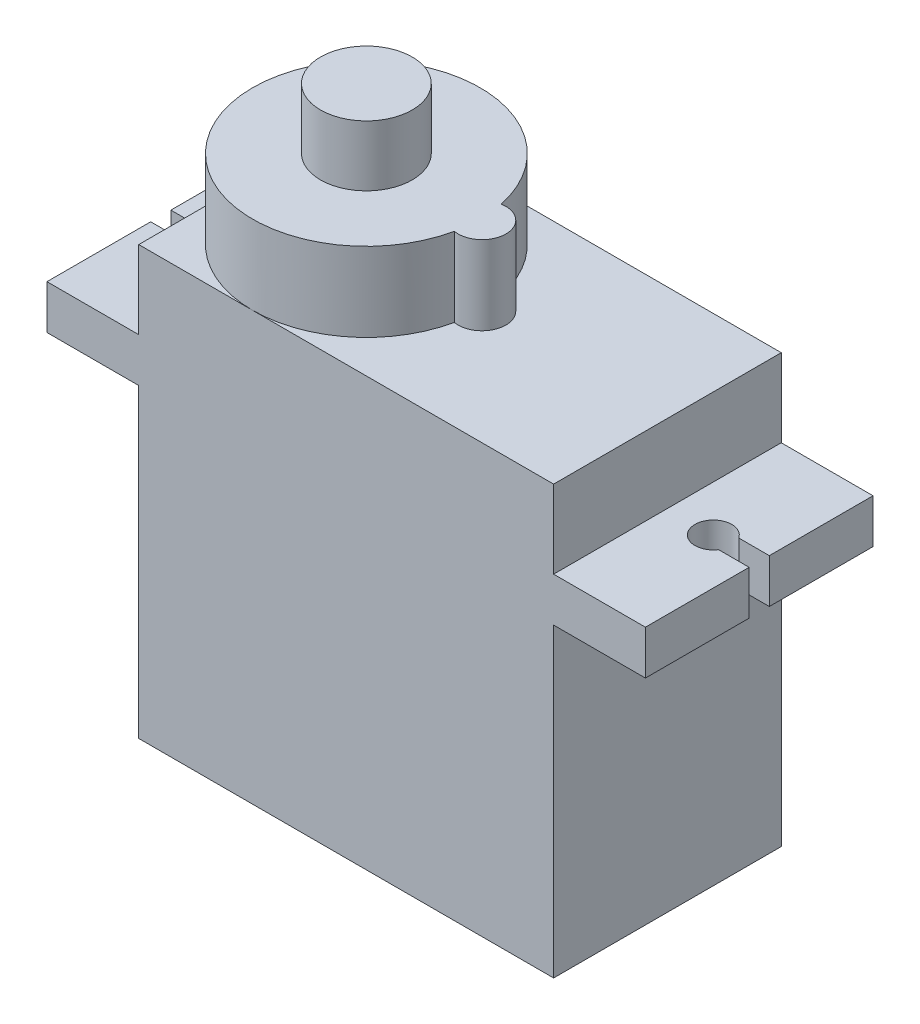
ISO-10303-21;
HEADER;
FILE_DESCRIPTION(('STEP AP214'),'2;1');
FILE_NAME('part.step','',(''),(''),'','','');
FILE_SCHEMA(('AUTOMOTIVE_DESIGN { 1 0 10303 214 1 1 1 1 }'));
ENDSEC;
DATA;
#1=APPLICATION_CONTEXT('core data for automotive mechanical design processes');
#2=APPLICATION_PROTOCOL_DEFINITION('international standard','automotive_design',2000,#1);
#3=PRODUCT_CONTEXT('',#1,'mechanical');
#4=PRODUCT('Part','Part','',(#3));
#5=PRODUCT_RELATED_PRODUCT_CATEGORY('part','',(#4));
#6=PRODUCT_DEFINITION_FORMATION('','',#4);
#7=PRODUCT_DEFINITION_CONTEXT('part definition',#1,'design');
#8=PRODUCT_DEFINITION('design','',#6,#7);
#9=PRODUCT_DEFINITION_SHAPE('','',#8);
#10=(LENGTH_UNIT() NAMED_UNIT(*) SI_UNIT(.MILLI.,.METRE.));
#11=(NAMED_UNIT(*) PLANE_ANGLE_UNIT() SI_UNIT($,.RADIAN.));
#12=(NAMED_UNIT(*) SI_UNIT($,.STERADIAN.) SOLID_ANGLE_UNIT());
#13=UNCERTAINTY_MEASURE_WITH_UNIT(LENGTH_MEASURE(1.E-05),#10,'distance_accuracy_value','');
#14=(GEOMETRIC_REPRESENTATION_CONTEXT(3) GLOBAL_UNCERTAINTY_ASSIGNED_CONTEXT((#13)) GLOBAL_UNIT_ASSIGNED_CONTEXT((#10,
#11,#12)) REPRESENTATION_CONTEXT('',''));
#15=CARTESIAN_POINT('',(0.,0.,0.));
#16=DIRECTION('',(0.,0.,1.));
#17=DIRECTION('',(1.,0.,0.));
#18=AXIS2_PLACEMENT_3D('',#15,#16,#17);
#19=CARTESIAN_POINT('',(-13.6,4.5,1.2));
#20=DIRECTION('',(1.,0.,0.));
#21=DIRECTION('',(0.,0.,-1.));
#22=AXIS2_PLACEMENT_3D('',#19,#20,#21);
#23=CYLINDRICAL_SURFACE('',#22,0.6);
#24=CARTESIAN_POINT('',(-13.6,4.5,1.2));
#25=DIRECTION('',(-1.,0.,0.));
#26=DIRECTION('',(0.,0.,1.));
#27=AXIS2_PLACEMENT_3D('',#24,#25,#26);
#28=CIRCLE('',#27,0.6);
#29=CARTESIAN_POINT('',(-13.6,4.5,1.8));
#30=VERTEX_POINT('',#29);
#31=EDGE_CURVE('E12',#30,#30,#28,.T.);
#32=ORIENTED_EDGE('',*,*,#31,.F.);
#33=EDGE_LOOP('',(#32));
#34=FACE_BOUND('',#33,.T.);
#35=CARTESIAN_POINT('',(-11.3,4.5,1.2));
#36=DIRECTION('',(-1.,0.,0.));
#37=DIRECTION('',(0.,0.,1.));
#38=AXIS2_PLACEMENT_3D('',#35,#36,#37);
#39=CIRCLE('',#38,0.6);
#40=CARTESIAN_POINT('',(-11.3,4.5,1.8));
#41=VERTEX_POINT('',#40);
#42=EDGE_CURVE('E67',#41,#41,#39,.T.);
#43=ORIENTED_EDGE('',*,*,#42,.T.);
#44=EDGE_LOOP('',(#43));
#45=FACE_BOUND('',#44,.T.);
#46=ADVANCED_FACE('F64',(#34,#45),#23,.T.);
#47=CARTESIAN_POINT('',(-13.6,0.,0.));
#48=DIRECTION('',(-1.,0.,0.));
#49=DIRECTION('',(0.,0.,1.));
#50=AXIS2_PLACEMENT_3D('',#47,#48,#49);
#51=PLANE('',#50);
#52=ORIENTED_EDGE('',*,*,#31,.T.);
#53=EDGE_LOOP('',(#52));
#54=FACE_BOUND('',#53,.T.);
#55=ADVANCED_FACE('F79',(#54),#51,.T.);
#56=CARTESIAN_POINT('',(-11.3,0.,0.));
#57=DIRECTION('',(-1.,0.,0.));
#58=DIRECTION('',(0.,0.,1.));
#59=AXIS2_PLACEMENT_3D('',#56,#57,#58);
#60=PLANE('',#59);
#61=ORIENTED_EDGE('',*,*,#42,.F.);
#62=EDGE_LOOP('',(#61));
#63=FACE_BOUND('',#62,.T.);
#64=ADVANCED_FACE('F77',(#63),#60,.F.);
#65=CLOSED_SHELL('',(#46,#55,#64));
#66=MANIFOLD_SOLID_BREP('B2',#65);
#67=CARTESIAN_POINT('',(-13.6,4.5,-1.2));
#68=DIRECTION('',(1.,0.,0.));
#69=DIRECTION('',(0.,0.,-1.));
#70=AXIS2_PLACEMENT_3D('',#67,#68,#69);
#71=CYLINDRICAL_SURFACE('',#70,0.6);
#72=CARTESIAN_POINT('',(-13.6,4.5,-1.2));
#73=DIRECTION('',(-1.,0.,0.));
#74=DIRECTION('',(0.,0.,1.));
#75=AXIS2_PLACEMENT_3D('',#72,#73,#74);
#76=CIRCLE('',#75,0.6);
#77=CARTESIAN_POINT('',(-13.6,4.5,-0.600000000000001));
#78=VERTEX_POINT('',#77);
#79=EDGE_CURVE('E63',#78,#78,#76,.T.);
#80=ORIENTED_EDGE('',*,*,#79,.F.);
#81=EDGE_LOOP('',(#80));
#82=FACE_BOUND('',#81,.T.);
#83=CARTESIAN_POINT('',(-11.3,4.5,-1.2));
#84=DIRECTION('',(-1.,0.,0.));
#85=DIRECTION('',(0.,0.,1.));
#86=AXIS2_PLACEMENT_3D('',#83,#84,#85);
#87=CIRCLE('',#86,0.6);
#88=CARTESIAN_POINT('',(-11.3,4.5,-0.600000000000001));
#89=VERTEX_POINT('',#88);
#90=EDGE_CURVE('E128',#89,#89,#87,.T.);
#91=ORIENTED_EDGE('',*,*,#90,.T.);
#92=EDGE_LOOP('',(#91));
#93=FACE_BOUND('',#92,.T.);
#94=ADVANCED_FACE('F125',(#82,#93),#71,.T.);
#95=CARTESIAN_POINT('',(-13.6,0.,0.));
#96=DIRECTION('',(-1.,0.,0.));
#97=DIRECTION('',(0.,0.,1.));
#98=AXIS2_PLACEMENT_3D('',#95,#96,#97);
#99=PLANE('',#98);
#100=ORIENTED_EDGE('',*,*,#79,.T.);
#101=EDGE_LOOP('',(#100));
#102=FACE_BOUND('',#101,.T.);
#103=ADVANCED_FACE('F140',(#102),#99,.T.);
#104=CARTESIAN_POINT('',(-11.3,0.,0.));
#105=DIRECTION('',(-1.,0.,0.));
#106=DIRECTION('',(0.,0.,1.));
#107=AXIS2_PLACEMENT_3D('',#104,#105,#106);
#108=PLANE('',#107);
#109=ORIENTED_EDGE('',*,*,#90,.F.);
#110=EDGE_LOOP('',(#109));
#111=FACE_BOUND('',#110,.T.);
#112=ADVANCED_FACE('F138',(#111),#108,.F.);
#113=CLOSED_SHELL('',(#94,#103,#112));
#114=MANIFOLD_SOLID_BREP('B7',#113);
#115=CARTESIAN_POINT('',(-13.6,4.5,0.));
#116=DIRECTION('',(1.,0.,0.));
#117=DIRECTION('',(0.,0.,-1.));
#118=AXIS2_PLACEMENT_3D('',#115,#116,#117);
#119=CYLINDRICAL_SURFACE('',#118,0.6);
#120=CARTESIAN_POINT('',(-13.6,4.5,0.));
#121=DIRECTION('',(-1.,0.,0.));
#122=DIRECTION('',(0.,0.,1.));
#123=AXIS2_PLACEMENT_3D('',#120,#121,#122);
#124=CIRCLE('',#123,0.6);
#125=CARTESIAN_POINT('',(-13.6,4.5,0.599999999999999));
#126=VERTEX_POINT('',#125);
#127=EDGE_CURVE('E124',#126,#126,#124,.T.);
#128=ORIENTED_EDGE('',*,*,#127,.F.);
#129=EDGE_LOOP('',(#128));
#130=FACE_BOUND('',#129,.T.);
#131=CARTESIAN_POINT('',(-11.3,4.5,0.));
#132=DIRECTION('',(-1.,0.,0.));
#133=DIRECTION('',(0.,0.,1.));
#134=AXIS2_PLACEMENT_3D('',#131,#132,#133);
#135=CIRCLE('',#134,0.6);
#136=CARTESIAN_POINT('',(-11.3,4.5,0.599999999999999));
#137=VERTEX_POINT('',#136);
#138=EDGE_CURVE('E190',#137,#137,#135,.T.);
#139=ORIENTED_EDGE('',*,*,#138,.T.);
#140=EDGE_LOOP('',(#139));
#141=FACE_BOUND('',#140,.T.);
#142=ADVANCED_FACE('F187',(#130,#141),#119,.T.);
#143=CARTESIAN_POINT('',(-13.6,0.,0.));
#144=DIRECTION('',(-1.,0.,0.));
#145=DIRECTION('',(0.,0.,1.));
#146=AXIS2_PLACEMENT_3D('',#143,#144,#145);
#147=PLANE('',#146);
#148=ORIENTED_EDGE('',*,*,#127,.T.);
#149=EDGE_LOOP('',(#148));
#150=FACE_BOUND('',#149,.T.);
#151=ADVANCED_FACE('F202',(#150),#147,.T.);
#152=CARTESIAN_POINT('',(-11.3,0.,0.));
#153=DIRECTION('',(-1.,0.,0.));
#154=DIRECTION('',(0.,0.,1.));
#155=AXIS2_PLACEMENT_3D('',#152,#153,#154);
#156=PLANE('',#155);
#157=ORIENTED_EDGE('',*,*,#138,.F.);
#158=EDGE_LOOP('',(#157));
#159=FACE_BOUND('',#158,.T.);
#160=ADVANCED_FACE('F200',(#159),#156,.F.);
#161=CLOSED_SHELL('',(#142,#151,#160));
#162=MANIFOLD_SOLID_BREP('B58',#161);
#163=CARTESIAN_POINT('',(0.,23.3,0.));
#164=DIRECTION('',(0.,-1.,0.));
#165=DIRECTION('',(0.,0.,-1.));
#166=AXIS2_PLACEMENT_3D('',#163,#164,#165);
#167=PLANE('',#166);
#168=CARTESIAN_POINT('',(1.2,23.3,0.));
#169=DIRECTION('',(0.,1.,0.));
#170=DIRECTION('',(0.,0.,1.));
#171=AXIS2_PLACEMENT_3D('',#168,#169,#170);
#172=CIRCLE('',#171,1.3);
#173=CARTESIAN_POINT('',(0.966666666666667,23.3,1.27888840621673));
#174=VERTEX_POINT('',#173);
#175=CARTESIAN_POINT('',(0.966666666666667,23.3,-1.27888840621673));
#176=VERTEX_POINT('',#175);
#177=EDGE_CURVE('E415',#174,#176,#172,.T.);
#178=ORIENTED_EDGE('',*,*,#177,.F.);
#179=CARTESIAN_POINT('',(-5.1,23.3,0.));
#180=DIRECTION('',(0.,1.,0.));
#181=DIRECTION('',(0.,0.,1.));
#182=AXIS2_PLACEMENT_3D('',#179,#180,#181);
#183=CIRCLE('',#182,6.2);
#184=CARTESIAN_POINT('',(-5.1,23.3,6.2));
#185=VERTEX_POINT('',#184);
#186=EDGE_CURVE('E263',#185,#174,#183,.T.);
#187=ORIENTED_EDGE('',*,*,#186,.F.);
#188=DIRECTION('',(1.,0.,0.));
#189=VECTOR('',#188,1.);
#190=CARTESIAN_POINT('',(-11.3,23.3,6.2));
#191=LINE('',#190,#189);
#192=CARTESIAN_POINT('',(11.3,23.3,6.2));
#193=VERTEX_POINT('',#192);
#194=EDGE_CURVE('E543',#185,#193,#191,.T.);
#195=ORIENTED_EDGE('',*,*,#194,.T.);
#196=DIRECTION('',(0.,0.,-1.));
#197=VECTOR('',#196,1.);
#198=CARTESIAN_POINT('',(11.3,23.3,6.2));
#199=LINE('',#198,#197);
#200=CARTESIAN_POINT('',(11.3,23.3,-6.2));
#201=VERTEX_POINT('',#200);
#202=EDGE_CURVE('E532',#193,#201,#199,.T.);
#203=ORIENTED_EDGE('',*,*,#202,.T.);
#204=DIRECTION('',(-1.,0.,0.));
#205=VECTOR('',#204,1.);
#206=CARTESIAN_POINT('',(-11.3,23.3,-6.2));
#207=LINE('',#206,#205);
#208=CARTESIAN_POINT('',(-5.1,23.3,-6.2));
#209=VERTEX_POINT('',#208);
#210=EDGE_CURVE('E537',#201,#209,#207,.T.);
#211=ORIENTED_EDGE('',*,*,#210,.T.);
#212=EDGE_CURVE('E257',#176,#209,#183,.T.);
#213=ORIENTED_EDGE('',*,*,#212,.F.);
#214=EDGE_LOOP('',(#178,#187,#195,#203,#211,#213));
#215=FACE_BOUND('',#214,.T.);
#216=ADVANCED_FACE('F240',(#215),#167,.F.);
#217=CARTESIAN_POINT('',(-11.3,23.3,0.));
#218=VERTEX_POINT('',#217);
#219=EDGE_CURVE('E249',#209,#218,#183,.T.);
#220=ORIENTED_EDGE('',*,*,#219,.F.);
#221=CARTESIAN_POINT('',(-11.3,23.3,-6.2));
#222=VERTEX_POINT('',#221);
#223=EDGE_CURVE('E535',#209,#222,#207,.T.);
#224=ORIENTED_EDGE('',*,*,#223,.T.);
#225=DIRECTION('',(0.,0.,1.));
#226=VECTOR('',#225,1.);
#227=CARTESIAN_POINT('',(-11.3,23.3,6.2));
#228=LINE('',#227,#226);
#229=EDGE_CURVE('E540',#222,#218,#228,.T.);
#230=ORIENTED_EDGE('',*,*,#229,.T.);
#231=EDGE_LOOP('',(#220,#224,#230));
#232=FACE_BOUND('',#231,.T.);
#233=ADVANCED_FACE('F634',(#232),#167,.F.);
#234=CARTESIAN_POINT('',(16.3,0.,0.));
#235=DIRECTION('',(1.,0.,0.));
#236=DIRECTION('',(0.,0.,-1.));
#237=AXIS2_PLACEMENT_3D('',#234,#235,#236);
#238=PLANE('',#237);
#239=DIRECTION('',(0.,1.,0.));
#240=VECTOR('',#239,1.);
#241=CARTESIAN_POINT('',(16.3,-0.001000000000001,-0.550000000000001));
#242=LINE('',#241,#240);
#243=CARTESIAN_POINT('',(16.3,16.65,-0.550000000000001));
#244=VERTEX_POINT('',#243);
#245=CARTESIAN_POINT('',(16.3,19.05,-0.550000000000001));
#246=VERTEX_POINT('',#245);
#247=EDGE_CURVE('E442',#244,#246,#242,.T.);
#248=ORIENTED_EDGE('',*,*,#247,.F.);
#249=DIRECTION('',(0.,0.,-1.));
#250=VECTOR('',#249,1.);
#251=CARTESIAN_POINT('',(16.3,16.65,6.2));
#252=LINE('',#251,#250);
#253=CARTESIAN_POINT('',(16.3,16.65,-6.2));
#254=VERTEX_POINT('',#253);
#255=EDGE_CURVE('E504',#244,#254,#252,.T.);
#256=ORIENTED_EDGE('',*,*,#255,.T.);
#257=DIRECTION('',(0.,1.,0.));
#258=VECTOR('',#257,1.);
#259=CARTESIAN_POINT('',(16.3,19.05,-6.2));
#260=LINE('',#259,#258);
#261=CARTESIAN_POINT('',(16.3,19.05,-6.2));
#262=VERTEX_POINT('',#261);
#263=EDGE_CURVE('E509',#254,#262,#260,.T.);
#264=ORIENTED_EDGE('',*,*,#263,.T.);
#265=DIRECTION('',(0.,0.,1.));
#266=VECTOR('',#265,1.);
#267=CARTESIAN_POINT('',(16.3,19.05,6.2));
#268=LINE('',#267,#266);
#269=EDGE_CURVE('E512',#262,#246,#268,.T.);
#270=ORIENTED_EDGE('',*,*,#269,.T.);
#271=EDGE_LOOP('',(#248,#256,#264,#270));
#272=FACE_BOUND('',#271,.T.);
#273=ADVANCED_FACE('F640',(#272),#238,.T.);
#274=CARTESIAN_POINT('',(-16.3,0.,0.));
#275=DIRECTION('',(-1.,0.,0.));
#276=DIRECTION('',(0.,0.,1.));
#277=AXIS2_PLACEMENT_3D('',#274,#275,#276);
#278=PLANE('',#277);
#279=DIRECTION('',(0.,1.,0.));
#280=VECTOR('',#279,1.);
#281=CARTESIAN_POINT('',(-16.3,-0.001000000000001,-0.55));
#282=LINE('',#281,#280);
#283=CARTESIAN_POINT('',(-16.3,16.65,-0.55));
#284=VERTEX_POINT('',#283);
#285=CARTESIAN_POINT('',(-16.3,19.05,-0.55));
#286=VERTEX_POINT('',#285);
#287=EDGE_CURVE('E462',#284,#286,#282,.T.);
#288=ORIENTED_EDGE('',*,*,#287,.T.);
#289=DIRECTION('',(0.,0.,-1.));
#290=VECTOR('',#289,1.);
#291=CARTESIAN_POINT('',(-16.3,19.05,6.2));
#292=LINE('',#291,#290);
#293=CARTESIAN_POINT('',(-16.3,19.05,-6.2));
#294=VERTEX_POINT('',#293);
#295=EDGE_CURVE('E475',#286,#294,#292,.T.);
#296=ORIENTED_EDGE('',*,*,#295,.T.);
#297=DIRECTION('',(0.,-1.,0.));
#298=VECTOR('',#297,1.);
#299=CARTESIAN_POINT('',(-16.3,19.05,-6.2));
#300=LINE('',#299,#298);
#301=CARTESIAN_POINT('',(-16.3,16.65,-6.2));
#302=VERTEX_POINT('',#301);
#303=EDGE_CURVE('E474',#294,#302,#300,.T.);
#304=ORIENTED_EDGE('',*,*,#303,.T.);
#305=DIRECTION('',(0.,0.,1.));
#306=VECTOR('',#305,1.);
#307=CARTESIAN_POINT('',(-16.3,16.65,-6.2));
#308=LINE('',#307,#306);
#309=EDGE_CURVE('E478',#302,#284,#308,.T.);
#310=ORIENTED_EDGE('',*,*,#309,.T.);
#311=EDGE_LOOP('',(#288,#296,#304,#310));
#312=FACE_BOUND('',#311,.T.);
#313=ADVANCED_FACE('F658',(#312),#278,.T.);
#314=CARTESIAN_POINT('',(-11.3,23.3,6.2));
#315=DIRECTION('',(1.,0.,0.));
#316=DIRECTION('',(0.,0.,-1.));
#317=AXIS2_PLACEMENT_3D('',#314,#315,#316);
#318=PLANE('',#317);
#319=DIRECTION('',(0.,0.,-1.));
#320=VECTOR('',#319,1.);
#321=CARTESIAN_POINT('',(-11.3,19.05,6.2));
#322=LINE('',#321,#320);
#323=CARTESIAN_POINT('',(-11.3,19.05,6.2));
#324=VERTEX_POINT('',#323);
#325=CARTESIAN_POINT('',(-11.3,19.05,-6.2));
#326=VERTEX_POINT('',#325);
#327=EDGE_CURVE('E449',#324,#326,#322,.T.);
#328=ORIENTED_EDGE('',*,*,#327,.F.);
#329=DIRECTION('',(0.,-1.,0.));
#330=VECTOR('',#329,1.);
#331=CARTESIAN_POINT('',(-11.3,23.3,6.2));
#332=LINE('',#331,#330);
#333=CARTESIAN_POINT('',(-11.3,23.3,6.2));
#334=VERTEX_POINT('',#333);
#335=EDGE_CURVE('E561',#334,#324,#332,.T.);
#336=ORIENTED_EDGE('',*,*,#335,.F.);
#337=EDGE_CURVE('E539',#218,#334,#228,.T.);
#338=ORIENTED_EDGE('',*,*,#337,.F.);
#339=ORIENTED_EDGE('',*,*,#229,.F.);
#340=DIRECTION('',(0.,-1.,0.));
#341=VECTOR('',#340,1.);
#342=CARTESIAN_POINT('',(-11.3,23.3,-6.2));
#343=LINE('',#342,#341);
#344=EDGE_CURVE('E564',#222,#326,#343,.T.);
#345=ORIENTED_EDGE('',*,*,#344,.T.);
#346=EDGE_LOOP('',(#328,#336,#338,#339,#345));
#347=FACE_BOUND('',#346,.T.);
#348=ADVANCED_FACE('F603',(#347),#318,.F.);
#349=DIRECTION('',(0.,0.,1.));
#350=VECTOR('',#349,1.);
#351=CARTESIAN_POINT('',(-11.3,16.65,-6.2));
#352=LINE('',#351,#350);
#353=CARTESIAN_POINT('',(-11.3,16.65,-6.2));
#354=VERTEX_POINT('',#353);
#355=CARTESIAN_POINT('',(-11.3,16.65,6.2));
#356=VERTEX_POINT('',#355);
#357=EDGE_CURVE('E486',#354,#356,#352,.T.);
#358=ORIENTED_EDGE('',*,*,#357,.F.);
#359=CARTESIAN_POINT('',(-11.3,0.,-6.2));
#360=VERTEX_POINT('',#359);
#361=EDGE_CURVE('E563',#354,#360,#343,.T.);
#362=ORIENTED_EDGE('',*,*,#361,.T.);
#363=DIRECTION('',(0.,0.,1.));
#364=VECTOR('',#363,1.);
#365=CARTESIAN_POINT('',(-11.3,0.,6.2));
#366=LINE('',#365,#364);
#367=CARTESIAN_POINT('',(-11.3,0.,6.2));
#368=VERTEX_POINT('',#367);
#369=EDGE_CURVE('E553',#360,#368,#366,.T.);
#370=ORIENTED_EDGE('',*,*,#369,.T.);
#371=EDGE_CURVE('E560',#356,#368,#332,.T.);
#372=ORIENTED_EDGE('',*,*,#371,.F.);
#373=EDGE_LOOP('',(#358,#362,#370,#372));
#374=FACE_BOUND('',#373,.T.);
#375=ADVANCED_FACE('F571',(#374),#318,.F.);
#376=CARTESIAN_POINT('',(11.3,23.3,6.2));
#377=DIRECTION('',(-1.,0.,0.));
#378=DIRECTION('',(0.,0.,1.));
#379=AXIS2_PLACEMENT_3D('',#376,#377,#378);
#380=PLANE('',#379);
#381=DIRECTION('',(0.,0.,1.));
#382=VECTOR('',#381,1.);
#383=CARTESIAN_POINT('',(11.3,19.05,6.2));
#384=LINE('',#383,#382);
#385=CARTESIAN_POINT('',(11.3,19.05,-6.2));
#386=VERTEX_POINT('',#385);
#387=CARTESIAN_POINT('',(11.3,19.05,6.2));
#388=VERTEX_POINT('',#387);
#389=EDGE_CURVE('E505',#386,#388,#384,.T.);
#390=ORIENTED_EDGE('',*,*,#389,.F.);
#391=DIRECTION('',(0.,-1.,0.));
#392=VECTOR('',#391,1.);
#393=CARTESIAN_POINT('',(11.3,23.3,-6.2));
#394=LINE('',#393,#392);
#395=EDGE_CURVE('E244',#201,#386,#394,.T.);
#396=ORIENTED_EDGE('',*,*,#395,.F.);
#397=ORIENTED_EDGE('',*,*,#202,.F.);
#398=DIRECTION('',(0.,-1.,0.));
#399=VECTOR('',#398,1.);
#400=CARTESIAN_POINT('',(11.3,23.3,6.2));
#401=LINE('',#400,#399);
#402=EDGE_CURVE('E558',#193,#388,#401,.T.);
#403=ORIENTED_EDGE('',*,*,#402,.T.);
#404=EDGE_LOOP('',(#390,#396,#397,#403));
#405=FACE_BOUND('',#404,.T.);
#406=ADVANCED_FACE('F242',(#405),#380,.F.);
#407=DIRECTION('',(0.,0.,-1.));
#408=VECTOR('',#407,1.);
#409=CARTESIAN_POINT('',(11.3,16.65,6.2));
#410=LINE('',#409,#408);
#411=CARTESIAN_POINT('',(11.3,16.65,6.2));
#412=VERTEX_POINT('',#411);
#413=CARTESIAN_POINT('',(11.3,16.65,-6.2));
#414=VERTEX_POINT('',#413);
#415=EDGE_CURVE('E500',#412,#414,#410,.T.);
#416=ORIENTED_EDGE('',*,*,#415,.F.);
#417=CARTESIAN_POINT('',(11.3,0.,6.2));
#418=VERTEX_POINT('',#417);
#419=EDGE_CURVE('E547',#412,#418,#401,.T.);
#420=ORIENTED_EDGE('',*,*,#419,.T.);
#421=DIRECTION('',(0.,0.,-1.));
#422=VECTOR('',#421,1.);
#423=CARTESIAN_POINT('',(11.3,0.,6.2));
#424=LINE('',#423,#422);
#425=CARTESIAN_POINT('',(11.3,0.,-6.2));
#426=VERTEX_POINT('',#425);
#427=EDGE_CURVE('E531',#418,#426,#424,.T.);
#428=ORIENTED_EDGE('',*,*,#427,.T.);
#429=EDGE_CURVE('E565',#414,#426,#394,.T.);
#430=ORIENTED_EDGE('',*,*,#429,.F.);
#431=EDGE_LOOP('',(#416,#420,#428,#430));
#432=FACE_BOUND('',#431,.T.);
#433=ADVANCED_FACE('F655',(#432),#380,.F.);
#434=CARTESIAN_POINT('',(-11.3,23.3,-6.2));
#435=DIRECTION('',(0.,0.,1.));
#436=DIRECTION('',(1.,0.,0.));
#437=AXIS2_PLACEMENT_3D('',#434,#435,#436);
#438=PLANE('',#437);
#439=DIRECTION('',(-1.,0.,0.));
#440=VECTOR('',#439,1.);
#441=CARTESIAN_POINT('',(-11.3,0.,-6.2));
#442=LINE('',#441,#440);
#443=EDGE_CURVE('E550',#426,#360,#442,.T.);
#444=ORIENTED_EDGE('',*,*,#443,.T.);
#445=ORIENTED_EDGE('',*,*,#361,.F.);
#446=DIRECTION('',(1.,0.,0.));
#447=VECTOR('',#446,1.);
#448=CARTESIAN_POINT('',(-16.3,16.65,-6.2));
#449=LINE('',#448,#447);
#450=EDGE_CURVE('E494',#302,#354,#449,.T.);
#451=ORIENTED_EDGE('',*,*,#450,.F.);
#452=ORIENTED_EDGE('',*,*,#303,.F.);
#453=DIRECTION('',(1.,0.,0.));
#454=VECTOR('',#453,1.);
#455=CARTESIAN_POINT('',(-16.3,19.05,-6.2));
#456=LINE('',#455,#454);
#457=EDGE_CURVE('E497',#294,#326,#456,.T.);
#458=ORIENTED_EDGE('',*,*,#457,.T.);
#459=ORIENTED_EDGE('',*,*,#344,.F.);
#460=ORIENTED_EDGE('',*,*,#223,.F.);
#461=ORIENTED_EDGE('',*,*,#210,.F.);
#462=ORIENTED_EDGE('',*,*,#395,.T.);
#463=DIRECTION('',(-1.,0.,0.));
#464=VECTOR('',#463,1.);
#465=CARTESIAN_POINT('',(16.3,19.05,-6.2));
#466=LINE('',#465,#464);
#467=EDGE_CURVE('E522',#262,#386,#466,.T.);
#468=ORIENTED_EDGE('',*,*,#467,.F.);
#469=ORIENTED_EDGE('',*,*,#263,.F.);
#470=DIRECTION('',(-1.,0.,0.));
#471=VECTOR('',#470,1.);
#472=CARTESIAN_POINT('',(16.3,16.65,-6.2));
#473=LINE('',#472,#471);
#474=EDGE_CURVE('E525',#254,#414,#473,.T.);
#475=ORIENTED_EDGE('',*,*,#474,.T.);
#476=ORIENTED_EDGE('',*,*,#429,.T.);
#477=EDGE_LOOP('',(#444,#445,#451,#452,#458,#459,#460,#461,#462,#468,#469,#475,#476));
#478=FACE_BOUND('',#477,.T.);
#479=ADVANCED_FACE('F577',(#478),#438,.F.);
#480=CARTESIAN_POINT('',(-11.3,23.3,6.2));
#481=DIRECTION('',(0.,0.,-1.));
#482=DIRECTION('',(-1.,0.,0.));
#483=AXIS2_PLACEMENT_3D('',#480,#481,#482);
#484=PLANE('',#483);
#485=DIRECTION('',(1.,0.,0.));
#486=VECTOR('',#485,1.);
#487=CARTESIAN_POINT('',(-11.3,0.,6.2));
#488=LINE('',#487,#486);
#489=EDGE_CURVE('E536',#368,#418,#488,.T.);
#490=ORIENTED_EDGE('',*,*,#489,.T.);
#491=ORIENTED_EDGE('',*,*,#419,.F.);
#492=DIRECTION('',(-1.,0.,0.));
#493=VECTOR('',#492,1.);
#494=CARTESIAN_POINT('',(16.3,16.65,6.2));
#495=LINE('',#494,#493);
#496=CARTESIAN_POINT('',(16.3,16.65,6.2));
#497=VERTEX_POINT('',#496);
#498=EDGE_CURVE('E528',#497,#412,#495,.T.);
#499=ORIENTED_EDGE('',*,*,#498,.F.);
#500=DIRECTION('',(0.,-1.,0.));
#501=VECTOR('',#500,1.);
#502=CARTESIAN_POINT('',(16.3,19.05,6.2));
#503=LINE('',#502,#501);
#504=CARTESIAN_POINT('',(16.3,19.05,6.2));
#505=VERTEX_POINT('',#504);
#506=EDGE_CURVE('E501',#505,#497,#503,.T.);
#507=ORIENTED_EDGE('',*,*,#506,.F.);
#508=DIRECTION('',(-1.,0.,0.));
#509=VECTOR('',#508,1.);
#510=CARTESIAN_POINT('',(16.3,19.05,6.2));
#511=LINE('',#510,#509);
#512=EDGE_CURVE('E515',#505,#388,#511,.T.);
#513=ORIENTED_EDGE('',*,*,#512,.T.);
#514=ORIENTED_EDGE('',*,*,#402,.F.);
#515=ORIENTED_EDGE('',*,*,#194,.F.);
#516=EDGE_CURVE('E544',#334,#185,#191,.T.);
#517=ORIENTED_EDGE('',*,*,#516,.F.);
#518=ORIENTED_EDGE('',*,*,#335,.T.);
#519=DIRECTION('',(1.,0.,0.));
#520=VECTOR('',#519,1.);
#521=CARTESIAN_POINT('',(-16.3,19.05,6.2));
#522=LINE('',#521,#520);
#523=CARTESIAN_POINT('',(-16.3,19.05,6.2));
#524=VERTEX_POINT('',#523);
#525=EDGE_CURVE('E483',#524,#324,#522,.T.);
#526=ORIENTED_EDGE('',*,*,#525,.F.);
#527=DIRECTION('',(0.,1.,0.));
#528=VECTOR('',#527,1.);
#529=CARTESIAN_POINT('',(-16.3,16.65,6.2));
#530=LINE('',#529,#528);
#531=CARTESIAN_POINT('',(-16.3,16.65,6.2));
#532=VERTEX_POINT('',#531);
#533=EDGE_CURVE('E481',#532,#524,#530,.T.);
#534=ORIENTED_EDGE('',*,*,#533,.F.);
#535=DIRECTION('',(1.,0.,0.));
#536=VECTOR('',#535,1.);
#537=CARTESIAN_POINT('',(-16.3,16.65,6.2));
#538=LINE('',#537,#536);
#539=EDGE_CURVE('E491',#532,#356,#538,.T.);
#540=ORIENTED_EDGE('',*,*,#539,.T.);
#541=ORIENTED_EDGE('',*,*,#371,.T.);
#542=EDGE_LOOP('',(#490,#491,#499,#507,#513,#514,#515,#517,#518,#526,#534,#540,#541));
#543=FACE_BOUND('',#542,.T.);
#544=ADVANCED_FACE('F583',(#543),#484,.F.);
#545=EDGE_CURVE('E610',#218,#185,#183,.T.);
#546=ORIENTED_EDGE('',*,*,#545,.F.);
#547=ORIENTED_EDGE('',*,*,#337,.T.);
#548=ORIENTED_EDGE('',*,*,#516,.T.);
#549=EDGE_LOOP('',(#546,#547,#548));
#550=FACE_BOUND('',#549,.T.);
#551=ADVANCED_FACE('F609',(#550),#167,.F.);
#552=CARTESIAN_POINT('',(0.,0.,0.));
#553=DIRECTION('',(0.,-1.,0.));
#554=DIRECTION('',(0.,0.,-1.));
#555=AXIS2_PLACEMENT_3D('',#552,#553,#554);
#556=PLANE('',#555);
#557=ORIENTED_EDGE('',*,*,#427,.F.);
#558=ORIENTED_EDGE('',*,*,#489,.F.);
#559=ORIENTED_EDGE('',*,*,#369,.F.);
#560=ORIENTED_EDGE('',*,*,#443,.F.);
#561=EDGE_LOOP('',(#557,#558,#559,#560));
#562=FACE_BOUND('',#561,.T.);
#563=ADVANCED_FACE('F580',(#562),#556,.T.);
#564=CARTESIAN_POINT('',(16.3,16.65,6.2));
#565=DIRECTION('',(0.,1.,0.));
#566=DIRECTION('',(0.,0.,1.));
#567=AXIS2_PLACEMENT_3D('',#564,#565,#566);
#568=PLANE('',#567);
#569=ORIENTED_EDGE('',*,*,#255,.F.);
#570=DIRECTION('',(1.,0.,0.));
#571=VECTOR('',#570,1.);
#572=CARTESIAN_POINT('',(16.3,16.65,-0.550000000000001));
#573=LINE('',#572,#571);
#574=CARTESIAN_POINT('',(14.6351646544245,16.65,-0.550000000000001));
#575=VERTEX_POINT('',#574);
#576=EDGE_CURVE('E427',#575,#244,#573,.T.);
#577=ORIENTED_EDGE('',*,*,#576,.F.);
#578=CARTESIAN_POINT('',(13.8,16.65,0.));
#579=DIRECTION('',(0.,1.,0.));
#580=DIRECTION('',(0.,0.,1.));
#581=AXIS2_PLACEMENT_3D('',#578,#579,#580);
#582=CIRCLE('',#581,1.);
#583=CARTESIAN_POINT('',(14.6351646544245,16.65,0.549999999999999));
#584=VERTEX_POINT('',#583);
#585=EDGE_CURVE('E424',#584,#575,#582,.F.);
#586=ORIENTED_EDGE('',*,*,#585,.F.);
#587=DIRECTION('',(-1.,0.,0.));
#588=VECTOR('',#587,1.);
#589=CARTESIAN_POINT('',(16.3,16.65,0.549999999999999));
#590=LINE('',#589,#588);
#591=CARTESIAN_POINT('',(16.3,16.65,0.549999999999999));
#592=VERTEX_POINT('',#591);
#593=EDGE_CURVE('E441',#592,#584,#590,.T.);
#594=ORIENTED_EDGE('',*,*,#593,.F.);
#595=EDGE_CURVE('E506',#497,#592,#252,.T.);
#596=ORIENTED_EDGE('',*,*,#595,.F.);
#597=ORIENTED_EDGE('',*,*,#498,.T.);
#598=ORIENTED_EDGE('',*,*,#415,.T.);
#599=ORIENTED_EDGE('',*,*,#474,.F.);
#600=EDGE_LOOP('',(#569,#577,#586,#594,#596,#597,#598,#599));
#601=FACE_BOUND('',#600,.T.);
#602=ADVANCED_FACE('F650',(#601),#568,.F.);
#603=CARTESIAN_POINT('',(16.3,19.05,6.2));
#604=DIRECTION('',(0.,-1.,0.));
#605=DIRECTION('',(0.,0.,-1.));
#606=AXIS2_PLACEMENT_3D('',#603,#604,#605);
#607=PLANE('',#606);
#608=CARTESIAN_POINT('',(13.8,19.05,0.));
#609=DIRECTION('',(0.,1.,0.));
#610=DIRECTION('',(0.,0.,1.));
#611=AXIS2_PLACEMENT_3D('',#608,#609,#610);
#612=CIRCLE('',#611,1.);
#613=CARTESIAN_POINT('',(14.6351646544245,19.05,-0.550000000000001));
#614=VERTEX_POINT('',#613);
#615=CARTESIAN_POINT('',(14.6351646544245,19.05,0.549999999999999));
#616=VERTEX_POINT('',#615);
#617=EDGE_CURVE('E430',#614,#616,#612,.T.);
#618=ORIENTED_EDGE('',*,*,#617,.F.);
#619=DIRECTION('',(-1.,0.,0.));
#620=VECTOR('',#619,1.);
#621=CARTESIAN_POINT('',(16.3,19.05,-0.550000000000001));
#622=LINE('',#621,#620);
#623=EDGE_CURVE('E435',#246,#614,#622,.T.);
#624=ORIENTED_EDGE('',*,*,#623,.F.);
#625=ORIENTED_EDGE('',*,*,#269,.F.);
#626=ORIENTED_EDGE('',*,*,#467,.T.);
#627=ORIENTED_EDGE('',*,*,#389,.T.);
#628=ORIENTED_EDGE('',*,*,#512,.F.);
#629=CARTESIAN_POINT('',(16.3,19.05,0.550000000000001));
#630=VERTEX_POINT('',#629);
#631=EDGE_CURVE('E511',#630,#505,#268,.T.);
#632=ORIENTED_EDGE('',*,*,#631,.F.);
#633=DIRECTION('',(1.,0.,0.));
#634=VECTOR('',#633,1.);
#635=CARTESIAN_POINT('',(16.3,19.05,0.549999999999999));
#636=LINE('',#635,#634);
#637=EDGE_CURVE('E433',#616,#630,#636,.T.);
#638=ORIENTED_EDGE('',*,*,#637,.F.);
#639=EDGE_LOOP('',(#618,#624,#625,#626,#627,#628,#632,#638));
#640=FACE_BOUND('',#639,.T.);
#641=ADVANCED_FACE('F829',(#640),#607,.F.);
#642=DIRECTION('',(0.,1.,0.));
#643=VECTOR('',#642,1.);
#644=CARTESIAN_POINT('',(16.3,-0.001000000000001,0.549999999999999));
#645=LINE('',#644,#643);
#646=EDGE_CURVE('E444',#592,#630,#645,.T.);
#647=ORIENTED_EDGE('',*,*,#646,.T.);
#648=ORIENTED_EDGE('',*,*,#631,.T.);
#649=ORIENTED_EDGE('',*,*,#506,.T.);
#650=ORIENTED_EDGE('',*,*,#595,.T.);
#651=EDGE_LOOP('',(#647,#648,#649,#650));
#652=FACE_BOUND('',#651,.T.);
#653=ADVANCED_FACE('F671',(#652),#238,.T.);
#654=CARTESIAN_POINT('',(-16.3,19.05,6.2));
#655=DIRECTION('',(0.,-1.,0.));
#656=DIRECTION('',(0.,0.,-1.));
#657=AXIS2_PLACEMENT_3D('',#654,#655,#656);
#658=PLANE('',#657);
#659=ORIENTED_EDGE('',*,*,#295,.F.);
#660=DIRECTION('',(-1.,0.,0.));
#661=VECTOR('',#660,1.);
#662=CARTESIAN_POINT('',(-16.3,19.05,-0.55));
#663=LINE('',#662,#661);
#664=CARTESIAN_POINT('',(-14.6351646544245,19.05,-0.55));
#665=VERTEX_POINT('',#664);
#666=EDGE_CURVE('E459',#665,#286,#663,.T.);
#667=ORIENTED_EDGE('',*,*,#666,.F.);
#668=CARTESIAN_POINT('',(-13.8,19.05,0.));
#669=DIRECTION('',(0.,1.,0.));
#670=DIRECTION('',(0.,0.,1.));
#671=AXIS2_PLACEMENT_3D('',#668,#669,#670);
#672=CIRCLE('',#671,1.);
#673=CARTESIAN_POINT('',(-14.6351646544245,19.05,0.55));
#674=VERTEX_POINT('',#673);
#675=EDGE_CURVE('E456',#674,#665,#672,.T.);
#676=ORIENTED_EDGE('',*,*,#675,.F.);
#677=DIRECTION('',(1.,0.,0.));
#678=VECTOR('',#677,1.);
#679=CARTESIAN_POINT('',(-16.3,19.05,0.55));
#680=LINE('',#679,#678);
#681=CARTESIAN_POINT('',(-16.3,19.05,0.55));
#682=VERTEX_POINT('',#681);
#683=EDGE_CURVE('E453',#682,#674,#680,.T.);
#684=ORIENTED_EDGE('',*,*,#683,.F.);
#685=EDGE_CURVE('E471',#524,#682,#292,.T.);
#686=ORIENTED_EDGE('',*,*,#685,.F.);
#687=ORIENTED_EDGE('',*,*,#525,.T.);
#688=ORIENTED_EDGE('',*,*,#327,.T.);
#689=ORIENTED_EDGE('',*,*,#457,.F.);
#690=EDGE_LOOP('',(#659,#667,#676,#684,#686,#687,#688,#689));
#691=FACE_BOUND('',#690,.T.);
#692=ADVANCED_FACE('F598',(#691),#658,.F.);
#693=CARTESIAN_POINT('',(-16.3,16.65,-6.2));
#694=DIRECTION('',(0.,1.,0.));
#695=DIRECTION('',(0.,0.,1.));
#696=AXIS2_PLACEMENT_3D('',#693,#694,#695);
#697=PLANE('',#696);
#698=CARTESIAN_POINT('',(-13.8,16.65,0.));
#699=DIRECTION('',(0.,1.,0.));
#700=DIRECTION('',(0.,0.,1.));
#701=AXIS2_PLACEMENT_3D('',#698,#699,#700);
#702=CIRCLE('',#701,1.);
#703=CARTESIAN_POINT('',(-14.6351646544245,16.65,-0.55));
#704=VERTEX_POINT('',#703);
#705=CARTESIAN_POINT('',(-14.6351646544245,16.65,0.55));
#706=VERTEX_POINT('',#705);
#707=EDGE_CURVE('E416',#704,#706,#702,.F.);
#708=ORIENTED_EDGE('',*,*,#707,.F.);
#709=DIRECTION('',(1.,0.,0.));
#710=VECTOR('',#709,1.);
#711=CARTESIAN_POINT('',(-16.3,16.65,-0.55));
#712=LINE('',#711,#710);
#713=EDGE_CURVE('E419',#284,#704,#712,.T.);
#714=ORIENTED_EDGE('',*,*,#713,.F.);
#715=ORIENTED_EDGE('',*,*,#309,.F.);
#716=ORIENTED_EDGE('',*,*,#450,.T.);
#717=ORIENTED_EDGE('',*,*,#357,.T.);
#718=ORIENTED_EDGE('',*,*,#539,.F.);
#719=CARTESIAN_POINT('',(-16.3,16.65,0.549999999999997));
#720=VERTEX_POINT('',#719);
#721=EDGE_CURVE('E477',#720,#532,#308,.T.);
#722=ORIENTED_EDGE('',*,*,#721,.F.);
#723=DIRECTION('',(-1.,0.,0.));
#724=VECTOR('',#723,1.);
#725=CARTESIAN_POINT('',(-16.3,16.65,0.55));
#726=LINE('',#725,#724);
#727=EDGE_CURVE('E428',#706,#720,#726,.T.);
#728=ORIENTED_EDGE('',*,*,#727,.F.);
#729=EDGE_LOOP('',(#708,#714,#715,#716,#717,#718,#722,#728));
#730=FACE_BOUND('',#729,.T.);
#731=ADVANCED_FACE('F589',(#730),#697,.F.);
#732=DIRECTION('',(0.,1.,0.));
#733=VECTOR('',#732,1.);
#734=CARTESIAN_POINT('',(-16.3,-0.001000000000001,0.55));
#735=LINE('',#734,#733);
#736=EDGE_CURVE('E461',#720,#682,#735,.T.);
#737=ORIENTED_EDGE('',*,*,#736,.F.);
#738=ORIENTED_EDGE('',*,*,#721,.T.);
#739=ORIENTED_EDGE('',*,*,#533,.T.);
#740=ORIENTED_EDGE('',*,*,#685,.T.);
#741=EDGE_LOOP('',(#737,#738,#739,#740));
#742=FACE_BOUND('',#741,.T.);
#743=ADVANCED_FACE('F664',(#742),#278,.T.);
#744=CARTESIAN_POINT('',(-16.3,-0.001000000000001,-0.55));
#745=DIRECTION('',(0.,0.,-1.));
#746=DIRECTION('',(-1.,0.,0.));
#747=AXIS2_PLACEMENT_3D('',#744,#745,#746);
#748=PLANE('',#747);
#749=ORIENTED_EDGE('',*,*,#713,.T.);
#750=DIRECTION('',(0.,1.,0.));
#751=VECTOR('',#750,1.);
#752=CARTESIAN_POINT('',(-14.6351646544245,-0.001000000000001,-0.55));
#753=LINE('',#752,#751);
#754=EDGE_CURVE('E465',#704,#665,#753,.T.);
#755=ORIENTED_EDGE('',*,*,#754,.T.);
#756=ORIENTED_EDGE('',*,*,#666,.T.);
#757=ORIENTED_EDGE('',*,*,#287,.F.);
#758=EDGE_LOOP('',(#749,#755,#756,#757));
#759=FACE_BOUND('',#758,.T.);
#760=ADVANCED_FACE('F675',(#759),#748,.F.);
#761=CARTESIAN_POINT('',(-13.8,-0.001000000000001,0.));
#762=DIRECTION('',(0.,1.,0.));
#763=DIRECTION('',(0.,0.,1.));
#764=AXIS2_PLACEMENT_3D('',#761,#762,#763);
#765=CYLINDRICAL_SURFACE('',#764,1.);
#766=ORIENTED_EDGE('',*,*,#707,.T.);
#767=DIRECTION('',(0.,1.,0.));
#768=VECTOR('',#767,1.);
#769=CARTESIAN_POINT('',(-14.6351646544245,-0.001000000000001,0.55));
#770=LINE('',#769,#768);
#771=EDGE_CURVE('E467',#706,#674,#770,.T.);
#772=ORIENTED_EDGE('',*,*,#771,.T.);
#773=ORIENTED_EDGE('',*,*,#675,.T.);
#774=ORIENTED_EDGE('',*,*,#754,.F.);
#775=EDGE_LOOP('',(#766,#772,#773,#774));
#776=FACE_BOUND('',#775,.T.);
#777=ADVANCED_FACE('F681',(#776),#765,.F.);
#778=CARTESIAN_POINT('',(-16.3,-0.001000000000001,0.55));
#779=DIRECTION('',(0.,0.,1.));
#780=DIRECTION('',(1.,0.,0.));
#781=AXIS2_PLACEMENT_3D('',#778,#779,#780);
#782=PLANE('',#781);
#783=ORIENTED_EDGE('',*,*,#727,.T.);
#784=ORIENTED_EDGE('',*,*,#736,.T.);
#785=ORIENTED_EDGE('',*,*,#683,.T.);
#786=ORIENTED_EDGE('',*,*,#771,.F.);
#787=EDGE_LOOP('',(#783,#784,#785,#786));
#788=FACE_BOUND('',#787,.T.);
#789=ADVANCED_FACE('F688',(#788),#782,.F.);
#790=CARTESIAN_POINT('',(13.8,-0.001000000000001,0.));
#791=DIRECTION('',(0.,1.,0.));
#792=DIRECTION('',(0.,0.,1.));
#793=AXIS2_PLACEMENT_3D('',#790,#791,#792);
#794=CYLINDRICAL_SURFACE('',#793,1.);
#795=ORIENTED_EDGE('',*,*,#585,.T.);
#796=DIRECTION('',(0.,1.,0.));
#797=VECTOR('',#796,1.);
#798=CARTESIAN_POINT('',(14.6351646544245,-0.001000000000001,-0.550000000000001));
#799=LINE('',#798,#797);
#800=EDGE_CURVE('E439',#575,#614,#799,.T.);
#801=ORIENTED_EDGE('',*,*,#800,.T.);
#802=ORIENTED_EDGE('',*,*,#617,.T.);
#803=DIRECTION('',(0.,1.,0.));
#804=VECTOR('',#803,1.);
#805=CARTESIAN_POINT('',(14.6351646544245,-0.001000000000001,0.549999999999999));
#806=LINE('',#805,#804);
#807=EDGE_CURVE('E438',#584,#616,#806,.T.);
#808=ORIENTED_EDGE('',*,*,#807,.F.);
#809=EDGE_LOOP('',(#795,#801,#802,#808));
#810=FACE_BOUND('',#809,.T.);
#811=ADVANCED_FACE('F696',(#810),#794,.F.);
#812=CARTESIAN_POINT('',(16.3,-0.001000000000001,-0.550000000000001));
#813=DIRECTION('',(0.,0.,-1.));
#814=DIRECTION('',(-1.,0.,0.));
#815=AXIS2_PLACEMENT_3D('',#812,#813,#814);
#816=PLANE('',#815);
#817=ORIENTED_EDGE('',*,*,#576,.T.);
#818=ORIENTED_EDGE('',*,*,#247,.T.);
#819=ORIENTED_EDGE('',*,*,#623,.T.);
#820=ORIENTED_EDGE('',*,*,#800,.F.);
#821=EDGE_LOOP('',(#817,#818,#819,#820));
#822=FACE_BOUND('',#821,.T.);
#823=ADVANCED_FACE('F700',(#822),#816,.F.);
#824=CARTESIAN_POINT('',(16.3,-0.001000000000001,0.549999999999999));
#825=DIRECTION('',(0.,0.,1.));
#826=DIRECTION('',(1.,0.,0.));
#827=AXIS2_PLACEMENT_3D('',#824,#825,#826);
#828=PLANE('',#827);
#829=ORIENTED_EDGE('',*,*,#593,.T.);
#830=ORIENTED_EDGE('',*,*,#807,.T.);
#831=ORIENTED_EDGE('',*,*,#637,.T.);
#832=ORIENTED_EDGE('',*,*,#646,.F.);
#833=EDGE_LOOP('',(#829,#830,#831,#832));
#834=FACE_BOUND('',#833,.T.);
#835=ADVANCED_FACE('F702',(#834),#828,.F.);
#836=CARTESIAN_POINT('',(1.2,27.6,0.));
#837=DIRECTION('',(0.,-1.,0.));
#838=DIRECTION('',(0.,0.,-1.));
#839=AXIS2_PLACEMENT_3D('',#836,#837,#838);
#840=CYLINDRICAL_SURFACE('',#839,1.3);
#841=ORIENTED_EDGE('',*,*,#177,.T.);
#842=DIRECTION('',(0.,-1.,0.));
#843=VECTOR('',#842,1.);
#844=CARTESIAN_POINT('',(0.966666666666667,27.6,-1.27888840621673));
#845=LINE('',#844,#843);
#846=CARTESIAN_POINT('',(0.966666666666667,27.6,-1.27888840621673));
#847=VERTEX_POINT('',#846);
#848=EDGE_CURVE('E403',#847,#176,#845,.T.);
#849=ORIENTED_EDGE('',*,*,#848,.F.);
#850=CARTESIAN_POINT('',(1.2,27.6,0.));
#851=DIRECTION('',(0.,1.,0.));
#852=DIRECTION('',(0.,0.,1.));
#853=AXIS2_PLACEMENT_3D('',#850,#851,#852);
#854=CIRCLE('',#853,1.3);
#855=CARTESIAN_POINT('',(0.966666666666667,27.6,1.27888840621673));
#856=VERTEX_POINT('',#855);
#857=EDGE_CURVE('E409',#856,#847,#854,.T.);
#858=ORIENTED_EDGE('',*,*,#857,.F.);
#859=DIRECTION('',(0.,-1.,0.));
#860=VECTOR('',#859,1.);
#861=CARTESIAN_POINT('',(0.966666666666667,27.6,1.27888840621673));
#862=LINE('',#861,#860);
#863=EDGE_CURVE('E406',#856,#174,#862,.T.);
#864=ORIENTED_EDGE('',*,*,#863,.T.);
#865=EDGE_LOOP('',(#841,#849,#858,#864));
#866=FACE_BOUND('',#865,.T.);
#867=ADVANCED_FACE('F414',(#866),#840,.T.);
#868=CARTESIAN_POINT('',(-5.1,27.6,0.));
#869=DIRECTION('',(0.,-1.,0.));
#870=DIRECTION('',(0.,0.,-1.));
#871=AXIS2_PLACEMENT_3D('',#868,#869,#870);
#872=CYLINDRICAL_SURFACE('',#871,6.2);
#873=ORIENTED_EDGE('',*,*,#212,.T.);
#874=ORIENTED_EDGE('',*,*,#219,.T.);
#875=ORIENTED_EDGE('',*,*,#545,.T.);
#876=ORIENTED_EDGE('',*,*,#186,.T.);
#877=ORIENTED_EDGE('',*,*,#863,.F.);
#878=CARTESIAN_POINT('',(-5.1,27.6,0.));
#879=DIRECTION('',(0.,1.,0.));
#880=DIRECTION('',(0.,0.,1.));
#881=AXIS2_PLACEMENT_3D('',#878,#879,#880);
#882=CIRCLE('',#881,6.2);
#883=EDGE_CURVE('E399',#847,#856,#882,.T.);
#884=ORIENTED_EDGE('',*,*,#883,.F.);
#885=ORIENTED_EDGE('',*,*,#848,.T.);
#886=EDGE_LOOP('',(#873,#874,#875,#876,#877,#884,#885));
#887=FACE_BOUND('',#886,.T.);
#888=ADVANCED_FACE('F401',(#887),#872,.T.);
#889=CARTESIAN_POINT('',(0.,27.6,0.));
#890=DIRECTION('',(0.,1.,0.));
#891=DIRECTION('',(0.,0.,1.));
#892=AXIS2_PLACEMENT_3D('',#889,#890,#891);
#893=PLANE('',#892);
#894=CARTESIAN_POINT('',(-5.1,27.6,0.));
#895=DIRECTION('',(0.,1.,0.));
#896=DIRECTION('',(0.,0.,1.));
#897=AXIS2_PLACEMENT_3D('',#894,#895,#896);
#898=CIRCLE('',#897,2.5);
#899=CARTESIAN_POINT('',(-5.1,27.6,2.5));
#900=VERTEX_POINT('',#899);
#901=EDGE_CURVE('E185',#900,#900,#898,.T.);
#902=ORIENTED_EDGE('',*,*,#901,.F.);
#903=EDGE_LOOP('',(#902));
#904=FACE_BOUND('',#903,.T.);
#905=ORIENTED_EDGE('',*,*,#857,.T.);
#906=ORIENTED_EDGE('',*,*,#883,.T.);
#907=EDGE_LOOP('',(#905,#906));
#908=FACE_BOUND('',#907,.T.);
#909=ADVANCED_FACE('F411',(#904,#908),#893,.T.);
#910=CARTESIAN_POINT('',(-5.1,30.9,0.));
#911=DIRECTION('',(0.,-1.,0.));
#912=DIRECTION('',(0.,0.,-1.));
#913=AXIS2_PLACEMENT_3D('',#910,#911,#912);
#914=CYLINDRICAL_SURFACE('',#913,2.5);
#915=CARTESIAN_POINT('',(-5.1,30.9,0.));
#916=DIRECTION('',(0.,1.,0.));
#917=DIRECTION('',(0.,0.,1.));
#918=AXIS2_PLACEMENT_3D('',#915,#916,#917);
#919=CIRCLE('',#918,2.5);
#920=CARTESIAN_POINT('',(-5.1,30.9,2.5));
#921=VERTEX_POINT('',#920);
#922=EDGE_CURVE('E613',#921,#921,#919,.T.);
#923=ORIENTED_EDGE('',*,*,#922,.F.);
#924=EDGE_LOOP('',(#923));
#925=FACE_BOUND('',#924,.T.);
#926=ORIENTED_EDGE('',*,*,#901,.T.);
#927=EDGE_LOOP('',(#926));
#928=FACE_BOUND('',#927,.T.);
#929=ADVANCED_FACE('F620',(#925,#928),#914,.T.);
#930=CARTESIAN_POINT('',(-5.1,30.9,0.));
#931=DIRECTION('',(0.,1.,0.));
#932=DIRECTION('',(0.,0.,1.));
#933=AXIS2_PLACEMENT_3D('',#930,#931,#932);
#934=PLANE('',#933);
#935=ORIENTED_EDGE('',*,*,#922,.T.);
#936=EDGE_LOOP('',(#935));
#937=FACE_BOUND('',#936,.T.);
#938=ADVANCED_FACE('F618',(#937),#934,.T.);
#939=CLOSED_SHELL('',(#216,#233,#273,#313,#348,#375,#406,#433,#479,#544,#551,#563,#602,#641,
#653,#692,#731,#743,#760,#777,#789,#811,#823,#835,#867,#888,#909,#929,#938));
#940=MANIFOLD_SOLID_BREP('B119',#939);
#941=ADVANCED_BREP_SHAPE_REPRESENTATION('',(#18,#66,#114,#162,#940),#14);
#942=SHAPE_DEFINITION_REPRESENTATION(#9,#941);
ENDSEC;
END-ISO-10303-21;
